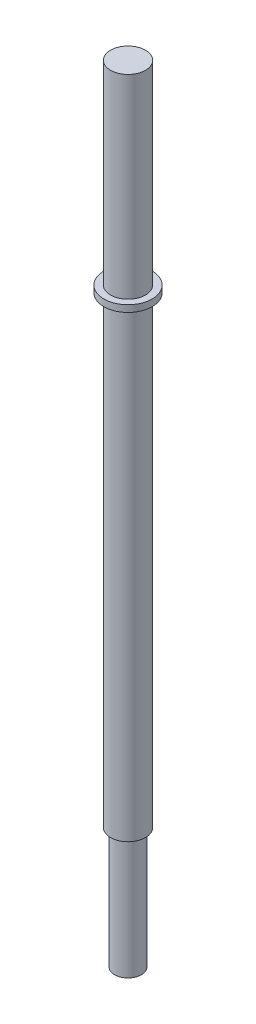
ISO-10303-21;
HEADER;
FILE_DESCRIPTION(('STEP AP214'),'2;1');
FILE_NAME('part.step','',(''),(''),'','','');
FILE_SCHEMA(('AUTOMOTIVE_DESIGN { 1 0 10303 214 1 1 1 1 }'));
ENDSEC;
DATA;
#1=APPLICATION_CONTEXT('core data for automotive mechanical design processes');
#2=APPLICATION_PROTOCOL_DEFINITION('international standard','automotive_design',2000,#1);
#3=PRODUCT_CONTEXT('',#1,'mechanical');
#4=PRODUCT('Part','Part','',(#3));
#5=PRODUCT_RELATED_PRODUCT_CATEGORY('part','',(#4));
#6=PRODUCT_DEFINITION_FORMATION('','',#4);
#7=PRODUCT_DEFINITION_CONTEXT('part definition',#1,'design');
#8=PRODUCT_DEFINITION('design','',#6,#7);
#9=PRODUCT_DEFINITION_SHAPE('','',#8);
#10=(LENGTH_UNIT() NAMED_UNIT(*) SI_UNIT(.MILLI.,.METRE.));
#11=(NAMED_UNIT(*) PLANE_ANGLE_UNIT() SI_UNIT($,.RADIAN.));
#12=(NAMED_UNIT(*) SI_UNIT($,.STERADIAN.) SOLID_ANGLE_UNIT());
#13=UNCERTAINTY_MEASURE_WITH_UNIT(LENGTH_MEASURE(1.E-05),#10,'distance_accuracy_value','');
#14=(GEOMETRIC_REPRESENTATION_CONTEXT(3) GLOBAL_UNCERTAINTY_ASSIGNED_CONTEXT((#13)) GLOBAL_UNIT_ASSIGNED_CONTEXT((#10,
#11,#12)) REPRESENTATION_CONTEXT('',''));
#15=CARTESIAN_POINT('',(0.,0.,0.));
#16=DIRECTION('',(0.,0.,1.));
#17=DIRECTION('',(1.,0.,0.));
#18=AXIS2_PLACEMENT_3D('',#15,#16,#17);
#19=CARTESIAN_POINT('',(0.,-29.718,0.));
#20=DIRECTION('',(0.,1.,0.));
#21=DIRECTION('',(0.,0.,1.));
#22=AXIS2_PLACEMENT_3D('',#19,#20,#21);
#23=PLANE('',#22);
#24=CARTESIAN_POINT('',(0.,-29.718,0.));
#25=DIRECTION('',(0.,-1.,0.));
#26=DIRECTION('',(0.,0.,-1.));
#27=AXIS2_PLACEMENT_3D('',#24,#25,#26);
#28=CIRCLE('',#27,0.508);
#29=CARTESIAN_POINT('',(0.,-29.718,-0.508));
#30=VERTEX_POINT('',#29);
#31=EDGE_CURVE('E10',#30,#30,#28,.T.);
#32=ORIENTED_EDGE('',*,*,#31,.T.);
#33=EDGE_LOOP('',(#32));
#34=FACE_BOUND('',#33,.T.);
#35=ADVANCED_FACE('F39',(#34),#23,.F.);
#36=CARTESIAN_POINT('',(0.,0.,0.));
#37=DIRECTION('',(0.,-1.,0.));
#38=DIRECTION('',(0.,0.,-1.));
#39=AXIS2_PLACEMENT_3D('',#36,#37,#38);
#40=CYLINDRICAL_SURFACE('',#39,0.508);
#41=ORIENTED_EDGE('',*,*,#31,.F.);
#42=EDGE_LOOP('',(#41));
#43=FACE_BOUND('',#42,.T.);
#44=CARTESIAN_POINT('',(0.,-25.146,0.));
#45=DIRECTION('',(0.,-1.,0.));
#46=DIRECTION('',(0.,0.,-1.));
#47=AXIS2_PLACEMENT_3D('',#44,#45,#46);
#48=CIRCLE('',#47,0.507999999999999);
#49=CARTESIAN_POINT('',(0.,-25.146,-0.507999999999999));
#50=VERTEX_POINT('',#49);
#51=EDGE_CURVE('E46',#50,#50,#48,.T.);
#52=ORIENTED_EDGE('',*,*,#51,.T.);
#53=EDGE_LOOP('',(#52));
#54=FACE_BOUND('',#53,.T.);
#55=ADVANCED_FACE('F92',(#43,#54),#40,.T.);
#56=CARTESIAN_POINT('',(0.,-25.146,0.));
#57=DIRECTION('',(0.,1.,0.));
#58=DIRECTION('',(0.,0.,1.));
#59=AXIS2_PLACEMENT_3D('',#56,#57,#58);
#60=PLANE('',#59);
#61=ORIENTED_EDGE('',*,*,#51,.F.);
#62=EDGE_LOOP('',(#61));
#63=FACE_BOUND('',#62,.T.);
#64=CARTESIAN_POINT('',(0.,-25.146,0.));
#65=DIRECTION('',(0.,-1.,0.));
#66=DIRECTION('',(0.,0.,-1.));
#67=AXIS2_PLACEMENT_3D('',#64,#65,#66);
#68=CIRCLE('',#67,0.6604);
#69=CARTESIAN_POINT('',(0.,-25.146,-0.6604));
#70=VERTEX_POINT('',#69);
#71=EDGE_CURVE('E51',#70,#70,#68,.T.);
#72=ORIENTED_EDGE('',*,*,#71,.T.);
#73=EDGE_LOOP('',(#72));
#74=FACE_BOUND('',#73,.T.);
#75=ADVANCED_FACE('F96',(#63,#74),#60,.F.);
#76=CARTESIAN_POINT('',(0.,0.,0.));
#77=DIRECTION('',(0.,-1.,0.));
#78=DIRECTION('',(0.,0.,-1.));
#79=AXIS2_PLACEMENT_3D('',#76,#77,#78);
#80=CYLINDRICAL_SURFACE('',#79,0.660399999999998);
#81=ORIENTED_EDGE('',*,*,#71,.F.);
#82=EDGE_LOOP('',(#81));
#83=FACE_BOUND('',#82,.T.);
#84=CARTESIAN_POINT('',(0.,-7.62,0.));
#85=DIRECTION('',(0.,-1.,0.));
#86=DIRECTION('',(0.,0.,-1.));
#87=AXIS2_PLACEMENT_3D('',#84,#85,#86);
#88=CIRCLE('',#87,0.660399999999998);
#89=CARTESIAN_POINT('',(0.,-7.62,-0.660399999999998));
#90=VERTEX_POINT('',#89);
#91=EDGE_CURVE('E56',#90,#90,#88,.T.);
#92=ORIENTED_EDGE('',*,*,#91,.T.);
#93=EDGE_LOOP('',(#92));
#94=FACE_BOUND('',#93,.T.);
#95=ADVANCED_FACE('F90',(#83,#94),#80,.T.);
#96=CARTESIAN_POINT('',(0.,-7.62,0.));
#97=DIRECTION('',(0.,1.,0.));
#98=DIRECTION('',(0.,0.,1.));
#99=AXIS2_PLACEMENT_3D('',#96,#97,#98);
#100=PLANE('',#99);
#101=ORIENTED_EDGE('',*,*,#91,.F.);
#102=EDGE_LOOP('',(#101));
#103=FACE_BOUND('',#102,.T.);
#104=CARTESIAN_POINT('',(0.,-7.62,0.));
#105=DIRECTION('',(0.,-1.,0.));
#106=DIRECTION('',(0.,0.,-1.));
#107=AXIS2_PLACEMENT_3D('',#104,#105,#106);
#108=CIRCLE('',#107,0.914400000000001);
#109=CARTESIAN_POINT('',(0.,-7.62,-0.914400000000001));
#110=VERTEX_POINT('',#109);
#111=EDGE_CURVE('E62',#110,#110,#108,.T.);
#112=ORIENTED_EDGE('',*,*,#111,.T.);
#113=EDGE_LOOP('',(#112));
#114=FACE_BOUND('',#113,.T.);
#115=ADVANCED_FACE('F104',(#103,#114),#100,.F.);
#116=CARTESIAN_POINT('',(0.,0.,0.));
#117=DIRECTION('',(0.,-1.,0.));
#118=DIRECTION('',(0.,0.,-1.));
#119=AXIS2_PLACEMENT_3D('',#116,#117,#118);
#120=CYLINDRICAL_SURFACE('',#119,0.914400000000001);
#121=ORIENTED_EDGE('',*,*,#111,.F.);
#122=EDGE_LOOP('',(#121));
#123=FACE_BOUND('',#122,.T.);
#124=CARTESIAN_POINT('',(0.,-7.366,0.));
#125=DIRECTION('',(0.,-1.,0.));
#126=DIRECTION('',(0.,0.,-1.));
#127=AXIS2_PLACEMENT_3D('',#124,#125,#126);
#128=CIRCLE('',#127,0.914400000000001);
#129=CARTESIAN_POINT('',(0.,-7.366,-0.914400000000001));
#130=VERTEX_POINT('',#129);
#131=EDGE_CURVE('E66',#130,#130,#128,.T.);
#132=ORIENTED_EDGE('',*,*,#131,.T.);
#133=EDGE_LOOP('',(#132));
#134=FACE_BOUND('',#133,.T.);
#135=ADVANCED_FACE('F107',(#123,#134),#120,.T.);
#136=CARTESIAN_POINT('',(0.,-7.366,0.));
#137=DIRECTION('',(0.,-1.,0.));
#138=DIRECTION('',(0.,0.,-1.));
#139=AXIS2_PLACEMENT_3D('',#136,#137,#138);
#140=PLANE('',#139);
#141=ORIENTED_EDGE('',*,*,#131,.F.);
#142=EDGE_LOOP('',(#141));
#143=FACE_BOUND('',#142,.T.);
#144=CARTESIAN_POINT('',(0.,-7.366,0.));
#145=DIRECTION('',(0.,-1.,0.));
#146=DIRECTION('',(0.,0.,-1.));
#147=AXIS2_PLACEMENT_3D('',#144,#145,#146);
#148=CIRCLE('',#147,0.660399999999998);
#149=CARTESIAN_POINT('',(0.,-7.366,-0.660399999999998));
#150=VERTEX_POINT('',#149);
#151=EDGE_CURVE('E70',#150,#150,#148,.T.);
#152=ORIENTED_EDGE('',*,*,#151,.T.);
#153=EDGE_LOOP('',(#152));
#154=FACE_BOUND('',#153,.T.);
#155=ADVANCED_FACE('F87',(#143,#154),#140,.F.);
#156=ORIENTED_EDGE('',*,*,#151,.F.);
#157=EDGE_LOOP('',(#156));
#158=FACE_BOUND('',#157,.T.);
#159=CARTESIAN_POINT('',(0.,0.,0.));
#160=DIRECTION('',(0.,-1.,0.));
#161=DIRECTION('',(0.,0.,-1.));
#162=AXIS2_PLACEMENT_3D('',#159,#160,#161);
#163=CIRCLE('',#162,0.660399999999997);
#164=CARTESIAN_POINT('',(0.,0.,-0.660399999999997));
#165=VERTEX_POINT('',#164);
#166=EDGE_CURVE('E74',#165,#165,#163,.T.);
#167=ORIENTED_EDGE('',*,*,#166,.T.);
#168=EDGE_LOOP('',(#167));
#169=FACE_BOUND('',#168,.T.);
#170=ADVANCED_FACE('F79',(#158,#169),#80,.T.);
#171=CARTESIAN_POINT('',(0.,0.,0.));
#172=DIRECTION('',(0.,-1.,0.));
#173=DIRECTION('',(0.,0.,-1.));
#174=AXIS2_PLACEMENT_3D('',#171,#172,#173);
#175=PLANE('',#174);
#176=ORIENTED_EDGE('',*,*,#166,.F.);
#177=EDGE_LOOP('',(#176));
#178=FACE_BOUND('',#177,.T.);
#179=ADVANCED_FACE('F81',(#178),#175,.F.);
#180=CLOSED_SHELL('',(#35,#55,#75,#95,#115,#135,#155,#170,#179));
#181=MANIFOLD_SOLID_BREP('B2',#180);
#182=ADVANCED_BREP_SHAPE_REPRESENTATION('',(#18,#181),#14);
#183=SHAPE_DEFINITION_REPRESENTATION(#9,#182);
ENDSEC;
END-ISO-10303-21;
